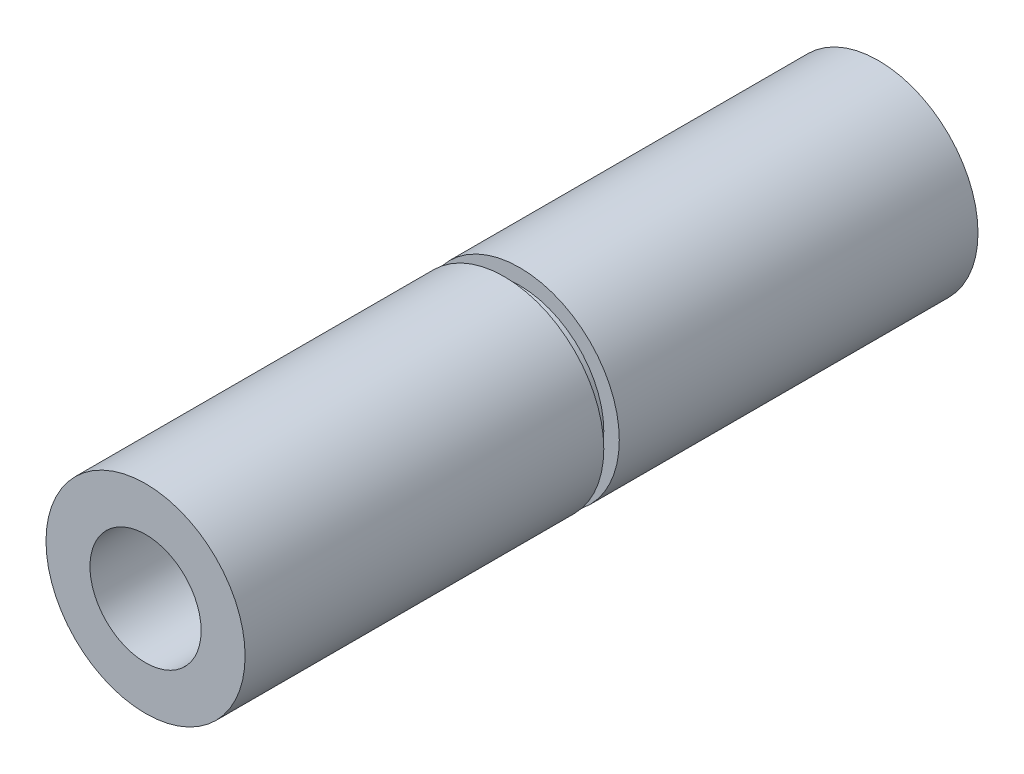
ISO-10303-21;
HEADER;
FILE_DESCRIPTION(('STEP AP214'),'2;1');
FILE_NAME('part.step','',(''),(''),'','','');
FILE_SCHEMA(('AUTOMOTIVE_DESIGN { 1 0 10303 214 1 1 1 1 }'));
ENDSEC;
DATA;
#1=APPLICATION_CONTEXT('core data for automotive mechanical design processes');
#2=APPLICATION_PROTOCOL_DEFINITION('international standard','automotive_design',2000,#1);
#3=PRODUCT_CONTEXT('',#1,'mechanical');
#4=PRODUCT('Part','Part','',(#3));
#5=PRODUCT_RELATED_PRODUCT_CATEGORY('part','',(#4));
#6=PRODUCT_DEFINITION_FORMATION('','',#4);
#7=PRODUCT_DEFINITION_CONTEXT('part definition',#1,'design');
#8=PRODUCT_DEFINITION('design','',#6,#7);
#9=PRODUCT_DEFINITION_SHAPE('','',#8);
#10=(LENGTH_UNIT() NAMED_UNIT(*) SI_UNIT(.MILLI.,.METRE.));
#11=(NAMED_UNIT(*) PLANE_ANGLE_UNIT() SI_UNIT($,.RADIAN.));
#12=(NAMED_UNIT(*) SI_UNIT($,.STERADIAN.) SOLID_ANGLE_UNIT());
#13=UNCERTAINTY_MEASURE_WITH_UNIT(LENGTH_MEASURE(1.E-05),#10,'distance_accuracy_value','');
#14=(GEOMETRIC_REPRESENTATION_CONTEXT(3) GLOBAL_UNCERTAINTY_ASSIGNED_CONTEXT((#13)) GLOBAL_UNIT_ASSIGNED_CONTEXT((#10,
#11,#12)) REPRESENTATION_CONTEXT('',''));
#15=CARTESIAN_POINT('',(0.,0.,0.));
#16=DIRECTION('',(0.,0.,1.));
#17=DIRECTION('',(1.,0.,0.));
#18=AXIS2_PLACEMENT_3D('',#15,#16,#17);
#19=CARTESIAN_POINT('',(48.7,49.3,27.));
#20=DIRECTION('',(0.,0.,1.));
#21=DIRECTION('',(1.,0.,0.));
#22=AXIS2_PLACEMENT_3D('',#19,#20,#21);
#23=CYLINDRICAL_SURFACE('',#22,3.85);
#24=CARTESIAN_POINT('',(48.7,49.3,40.872415865385));
#25=DIRECTION('',(0.,0.,1.));
#26=DIRECTION('',(1.,0.,0.));
#27=AXIS2_PLACEMENT_3D('',#24,#25,#26);
#28=CIRCLE('',#27,3.85);
#29=CARTESIAN_POINT('',(52.55,49.3,40.872415865385));
#30=VERTEX_POINT('',#29);
#31=EDGE_CURVE('E18',#30,#30,#28,.T.);
#32=ORIENTED_EDGE('',*,*,#31,.F.);
#33=DIRECTION('',(0.,0.,1.));
#34=VECTOR('',#33,1.);
#35=CARTESIAN_POINT('',(52.55,49.3,27.));
#36=LINE('',#35,#34);
#37=CARTESIAN_POINT('',(52.55,49.3,27.));
#38=VERTEX_POINT('',#37);
#39=EDGE_CURVE('E9',#38,#30,#36,.T.);
#40=ORIENTED_EDGE('',*,*,#39,.F.);
#41=CARTESIAN_POINT('',(48.7,49.3,27.));
#42=DIRECTION('',(0.,0.,1.));
#43=DIRECTION('',(1.,0.,0.));
#44=AXIS2_PLACEMENT_3D('',#41,#42,#43);
#45=CIRCLE('',#44,3.85);
#46=EDGE_CURVE('E24',#38,#38,#45,.T.);
#47=ORIENTED_EDGE('',*,*,#46,.T.);
#48=ORIENTED_EDGE('',*,*,#39,.T.);
#49=EDGE_LOOP('',(#32,#40,#47,#48));
#50=FACE_BOUND('',#49,.T.);
#51=ADVANCED_FACE('F14',(#50),#23,.T.);
#52=CARTESIAN_POINT('',(48.7,49.3,27.));
#53=DIRECTION('',(0.,0.,1.));
#54=DIRECTION('',(1.,0.,0.));
#55=AXIS2_PLACEMENT_3D('',#52,#53,#54);
#56=PLANE('',#55);
#57=CARTESIAN_POINT('',(48.7,49.3,27.));
#58=DIRECTION('',(0.,0.,1.));
#59=DIRECTION('',(1.,0.,0.));
#60=AXIS2_PLACEMENT_3D('',#57,#58,#59);
#61=CIRCLE('',#60,2.15);
#62=CARTESIAN_POINT('',(50.85,49.3,27.));
#63=VERTEX_POINT('',#62);
#64=EDGE_CURVE('E100',#63,#63,#61,.T.);
#65=ORIENTED_EDGE('',*,*,#64,.T.);
#66=EDGE_LOOP('',(#65));
#67=FACE_BOUND('',#66,.T.);
#68=ORIENTED_EDGE('',*,*,#46,.F.);
#69=EDGE_LOOP('',(#68));
#70=FACE_BOUND('',#69,.T.);
#71=ADVANCED_FACE('F130',(#67,#70),#56,.F.);
#72=CARTESIAN_POINT('',(48.7,49.3,40.872415865385));
#73=DIRECTION('',(0.,0.,1.));
#74=DIRECTION('',(1.,0.,0.));
#75=AXIS2_PLACEMENT_3D('',#72,#73,#74);
#76=PLANE('',#75);
#77=CARTESIAN_POINT('',(48.7,49.3,40.872415865385));
#78=DIRECTION('',(0.,0.,1.));
#79=DIRECTION('',(1.,0.,0.));
#80=AXIS2_PLACEMENT_3D('',#77,#78,#79);
#81=CIRCLE('',#80,3.25);
#82=CARTESIAN_POINT('',(51.95,49.3,40.872415865385));
#83=VERTEX_POINT('',#82);
#84=EDGE_CURVE('E101',#83,#83,#81,.T.);
#85=ORIENTED_EDGE('',*,*,#84,.F.);
#86=EDGE_LOOP('',(#85));
#87=FACE_BOUND('',#86,.T.);
#88=ORIENTED_EDGE('',*,*,#31,.T.);
#89=EDGE_LOOP('',(#88));
#90=FACE_BOUND('',#89,.T.);
#91=ADVANCED_FACE('F134',(#87,#90),#76,.T.);
#92=CARTESIAN_POINT('',(48.7,49.3,26.5));
#93=DIRECTION('',(0.,0.,1.));
#94=DIRECTION('',(1.,0.,0.));
#95=AXIS2_PLACEMENT_3D('',#92,#93,#94);
#96=CYLINDRICAL_SURFACE('',#95,2.15);
#97=DIRECTION('',(0.,0.,1.));
#98=VECTOR('',#97,1.);
#99=CARTESIAN_POINT('',(50.85,49.3,26.5));
#100=LINE('',#99,#98);
#101=CARTESIAN_POINT('',(50.85,49.3,55.344831730769));
#102=VERTEX_POINT('',#101);
#103=EDGE_CURVE('E58',#63,#102,#100,.T.);
#104=ORIENTED_EDGE('',*,*,#103,.F.);
#105=ORIENTED_EDGE('',*,*,#64,.F.);
#106=ORIENTED_EDGE('',*,*,#103,.T.);
#107=CARTESIAN_POINT('',(48.7,49.3,55.344831730769));
#108=DIRECTION('',(0.,0.,1.));
#109=DIRECTION('',(1.,0.,0.));
#110=AXIS2_PLACEMENT_3D('',#107,#108,#109);
#111=CIRCLE('',#110,2.15);
#112=EDGE_CURVE('E96',#102,#102,#111,.T.);
#113=ORIENTED_EDGE('',*,*,#112,.T.);
#114=EDGE_LOOP('',(#104,#105,#106,#113));
#115=FACE_BOUND('',#114,.T.);
#116=ADVANCED_FACE('F116',(#115),#96,.F.);
#117=CARTESIAN_POINT('',(48.7,49.3,40.672415865385));
#118=DIRECTION('',(0.,0.,1.));
#119=DIRECTION('',(1.,0.,0.));
#120=AXIS2_PLACEMENT_3D('',#117,#118,#119);
#121=CYLINDRICAL_SURFACE('',#120,3.25);
#122=CARTESIAN_POINT('',(48.7,49.3,41.472415865385));
#123=DIRECTION('',(0.,0.,1.));
#124=DIRECTION('',(1.,0.,0.));
#125=AXIS2_PLACEMENT_3D('',#122,#123,#124);
#126=CIRCLE('',#125,3.25);
#127=CARTESIAN_POINT('',(51.95,49.3,41.472415865385));
#128=VERTEX_POINT('',#127);
#129=EDGE_CURVE('E90',#128,#128,#126,.T.);
#130=ORIENTED_EDGE('',*,*,#129,.F.);
#131=DIRECTION('',(0.,0.,1.));
#132=VECTOR('',#131,1.);
#133=CARTESIAN_POINT('',(51.95,49.3,40.672415865385));
#134=LINE('',#133,#132);
#135=EDGE_CURVE('E70',#83,#128,#134,.T.);
#136=ORIENTED_EDGE('',*,*,#135,.F.);
#137=ORIENTED_EDGE('',*,*,#84,.T.);
#138=ORIENTED_EDGE('',*,*,#135,.T.);
#139=EDGE_LOOP('',(#130,#136,#137,#138));
#140=FACE_BOUND('',#139,.T.);
#141=ADVANCED_FACE('F120',(#140),#121,.T.);
#142=CARTESIAN_POINT('',(48.7,49.3,55.344831730769));
#143=DIRECTION('',(0.,0.,1.));
#144=DIRECTION('',(1.,0.,0.));
#145=AXIS2_PLACEMENT_3D('',#142,#143,#144);
#146=PLANE('',#145);
#147=ORIENTED_EDGE('',*,*,#112,.F.);
#148=EDGE_LOOP('',(#147));
#149=FACE_BOUND('',#148,.T.);
#150=CARTESIAN_POINT('',(48.7,49.3,55.344831730769));
#151=DIRECTION('',(0.,0.,1.));
#152=DIRECTION('',(1.,0.,0.));
#153=AXIS2_PLACEMENT_3D('',#150,#151,#152);
#154=CIRCLE('',#153,3.85);
#155=CARTESIAN_POINT('',(52.55,49.3,55.344831730769));
#156=VERTEX_POINT('',#155);
#157=EDGE_CURVE('E77',#156,#156,#154,.T.);
#158=ORIENTED_EDGE('',*,*,#157,.T.);
#159=EDGE_LOOP('',(#158));
#160=FACE_BOUND('',#159,.T.);
#161=ADVANCED_FACE('F78',(#149,#160),#146,.T.);
#162=CARTESIAN_POINT('',(48.7,49.3,41.472415865385));
#163=DIRECTION('',(0.,0.,1.));
#164=DIRECTION('',(1.,0.,0.));
#165=AXIS2_PLACEMENT_3D('',#162,#163,#164);
#166=PLANE('',#165);
#167=ORIENTED_EDGE('',*,*,#129,.T.);
#168=EDGE_LOOP('',(#167));
#169=FACE_BOUND('',#168,.T.);
#170=CARTESIAN_POINT('',(48.7,49.3,41.472415865385));
#171=DIRECTION('',(0.,0.,1.));
#172=DIRECTION('',(1.,0.,0.));
#173=AXIS2_PLACEMENT_3D('',#170,#171,#172);
#174=CIRCLE('',#173,3.85);
#175=CARTESIAN_POINT('',(52.55,49.3,41.472415865385));
#176=VERTEX_POINT('',#175);
#177=EDGE_CURVE('E83',#176,#176,#174,.T.);
#178=ORIENTED_EDGE('',*,*,#177,.F.);
#179=EDGE_LOOP('',(#178));
#180=FACE_BOUND('',#179,.T.);
#181=ADVANCED_FACE('F119',(#169,#180),#166,.F.);
#182=CARTESIAN_POINT('',(48.7,49.3,27.));
#183=DIRECTION('',(0.,0.,1.));
#184=DIRECTION('',(1.,0.,0.));
#185=AXIS2_PLACEMENT_3D('',#182,#183,#184);
#186=CYLINDRICAL_SURFACE('',#185,3.85);
#187=DIRECTION('',(0.,0.,1.));
#188=VECTOR('',#187,1.);
#189=CARTESIAN_POINT('',(52.55,49.3,27.));
#190=LINE('',#189,#188);
#191=EDGE_CURVE('E84',#176,#156,#190,.T.);
#192=ORIENTED_EDGE('',*,*,#191,.T.);
#193=ORIENTED_EDGE('',*,*,#157,.F.);
#194=ORIENTED_EDGE('',*,*,#191,.F.);
#195=ORIENTED_EDGE('',*,*,#177,.T.);
#196=EDGE_LOOP('',(#192,#193,#194,#195));
#197=FACE_BOUND('',#196,.T.);
#198=ADVANCED_FACE('F16',(#197),#186,.T.);
#199=CLOSED_SHELL('',(#51,#71,#91,#116,#141,#161,#181,#198));
#200=MANIFOLD_SOLID_BREP('B1',#199);
#201=ADVANCED_BREP_SHAPE_REPRESENTATION('',(#18,#200),#14);
#202=SHAPE_DEFINITION_REPRESENTATION(#9,#201);
ENDSEC;
END-ISO-10303-21;
